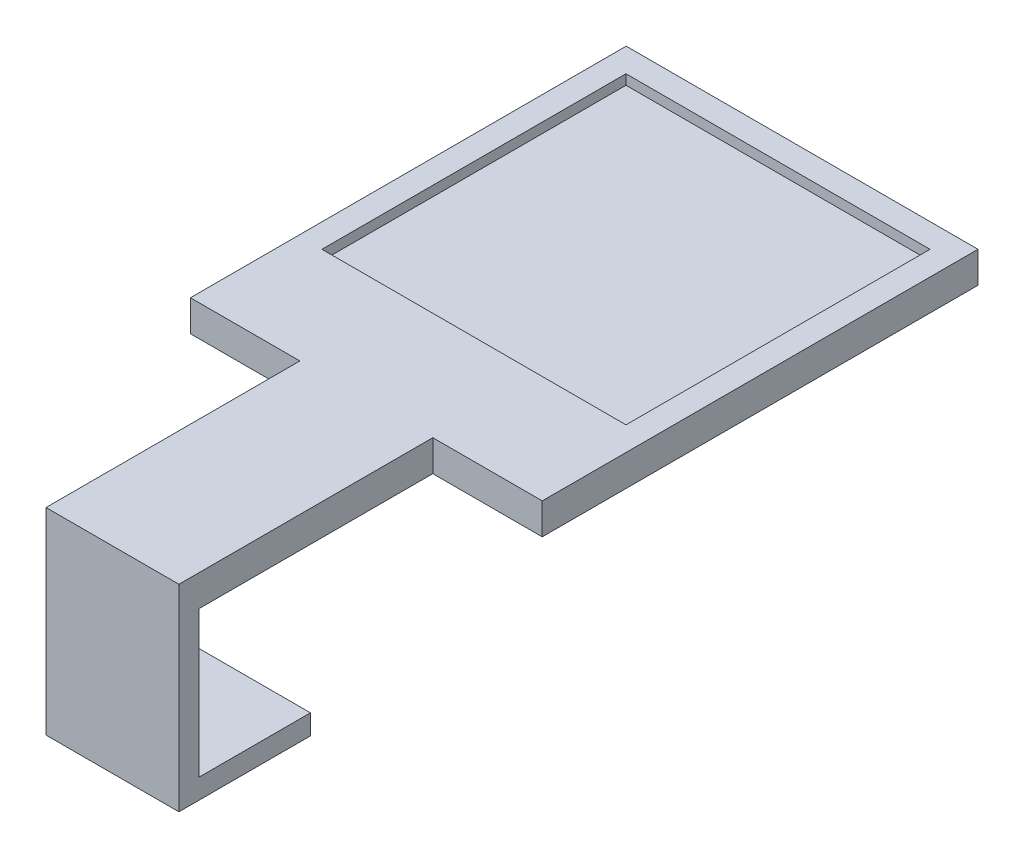
ISO-10303-21;
HEADER;
FILE_DESCRIPTION(('STEP AP214'),'2;1');
FILE_NAME('part.step','',(''),(''),'','','');
FILE_SCHEMA(('AUTOMOTIVE_DESIGN { 1 0 10303 214 1 1 1 1 }'));
ENDSEC;
DATA;
#1=APPLICATION_CONTEXT('core data for automotive mechanical design processes');
#2=APPLICATION_PROTOCOL_DEFINITION('international standard','automotive_design',2000,#1);
#3=PRODUCT_CONTEXT('',#1,'mechanical');
#4=PRODUCT('Part','Part','',(#3));
#5=PRODUCT_RELATED_PRODUCT_CATEGORY('part','',(#4));
#6=PRODUCT_DEFINITION_FORMATION('','',#4);
#7=PRODUCT_DEFINITION_CONTEXT('part definition',#1,'design');
#8=PRODUCT_DEFINITION('design','',#6,#7);
#9=PRODUCT_DEFINITION_SHAPE('','',#8);
#10=(LENGTH_UNIT() NAMED_UNIT(*) SI_UNIT(.MILLI.,.METRE.));
#11=(NAMED_UNIT(*) PLANE_ANGLE_UNIT() SI_UNIT($,.RADIAN.));
#12=(NAMED_UNIT(*) SI_UNIT($,.STERADIAN.) SOLID_ANGLE_UNIT());
#13=UNCERTAINTY_MEASURE_WITH_UNIT(LENGTH_MEASURE(1.E-05),#10,'distance_accuracy_value','');
#14=(GEOMETRIC_REPRESENTATION_CONTEXT(3) GLOBAL_UNCERTAINTY_ASSIGNED_CONTEXT((#13)) GLOBAL_UNIT_ASSIGNED_CONTEXT((#10,
#11,#12)) REPRESENTATION_CONTEXT('',''));
#15=CARTESIAN_POINT('',(0.,0.,0.));
#16=DIRECTION('',(0.,0.,1.));
#17=DIRECTION('',(1.,0.,0.));
#18=AXIS2_PLACEMENT_3D('',#15,#16,#17);
#19=CARTESIAN_POINT('',(-2.35262430939226,-12.88,26.7906077348067));
#20=DIRECTION('',(0.,0.,-1.));
#21=DIRECTION('',(-1.,0.,0.));
#22=AXIS2_PLACEMENT_3D('',#19,#20,#21);
#23=PLANE('',#22);
#24=DIRECTION('',(0.,1.,0.));
#25=VECTOR('',#24,1.);
#26=CARTESIAN_POINT('',(4.29737569060774,-12.88,26.7906077348067));
#27=LINE('',#26,#25);
#28=CARTESIAN_POINT('',(4.29737569060774,-7.3,26.7906077348067));
#29=VERTEX_POINT('',#28);
#30=CARTESIAN_POINT('',(4.29737569060774,0.,26.7906077348067));
#31=VERTEX_POINT('',#30);
#32=EDGE_CURVE('E175',#29,#31,#27,.T.);
#33=ORIENTED_EDGE('',*,*,#32,.F.);
#34=DIRECTION('',(1.,0.,0.));
#35=VECTOR('',#34,1.);
#36=CARTESIAN_POINT('',(4.29737569060774,-7.3,26.7906077348067));
#37=LINE('',#36,#35);
#38=CARTESIAN_POINT('',(-2.35262430939226,-7.3,26.7906077348067));
#39=VERTEX_POINT('',#38);
#40=EDGE_CURVE('E343',#39,#29,#37,.T.);
#41=ORIENTED_EDGE('',*,*,#40,.F.);
#42=DIRECTION('',(0.,1.,0.));
#43=VECTOR('',#42,1.);
#44=CARTESIAN_POINT('',(-2.35262430939226,-12.88,26.7906077348067));
#45=LINE('',#44,#43);
#46=CARTESIAN_POINT('',(-2.35262430939226,0.,26.7906077348067));
#47=VERTEX_POINT('',#46);
#48=EDGE_CURVE('E56',#39,#47,#45,.T.);
#49=ORIENTED_EDGE('',*,*,#48,.T.);
#50=DIRECTION('',(-1.,0.,0.));
#51=VECTOR('',#50,1.);
#52=CARTESIAN_POINT('',(-2.35262430939226,0.,26.7906077348067));
#53=LINE('',#52,#51);
#54=EDGE_CURVE('E160',#31,#47,#53,.T.);
#55=ORIENTED_EDGE('',*,*,#54,.F.);
#56=EDGE_LOOP('',(#33,#41,#49,#55));
#57=FACE_BOUND('',#56,.T.);
#58=ADVANCED_FACE('F34',(#57),#23,.T.);
#59=CARTESIAN_POINT('',(-7.82762430939226,1.56,15.0906077348067));
#60=DIRECTION('',(0.,0.,-1.));
#61=DIRECTION('',(-1.,0.,0.));
#62=AXIS2_PLACEMENT_3D('',#59,#60,#61);
#63=PLANE('',#62);
#64=DIRECTION('',(0.,-1.,0.));
#65=VECTOR('',#64,1.);
#66=CARTESIAN_POINT('',(-2.35262430939226,1.56,15.0906077348067));
#67=LINE('',#66,#65);
#68=CARTESIAN_POINT('',(-2.35262430939226,1.56,15.0906077348067));
#69=VERTEX_POINT('',#68);
#70=CARTESIAN_POINT('',(-2.35262430939226,0.,15.0906077348067));
#71=VERTEX_POINT('',#70);
#72=EDGE_CURVE('E181',#69,#71,#67,.T.);
#73=ORIENTED_EDGE('',*,*,#72,.F.);
#74=DIRECTION('',(1.,0.,0.));
#75=VECTOR('',#74,1.);
#76=CARTESIAN_POINT('',(-7.82762430939226,1.56,15.0906077348067));
#77=LINE('',#76,#75);
#78=CARTESIAN_POINT('',(-7.82762430939226,1.56,15.0906077348067));
#79=VERTEX_POINT('',#78);
#80=EDGE_CURVE('E231',#79,#69,#77,.T.);
#81=ORIENTED_EDGE('',*,*,#80,.F.);
#82=DIRECTION('',(0.,-1.,0.));
#83=VECTOR('',#82,1.);
#84=CARTESIAN_POINT('',(-7.82762430939226,1.56,15.0906077348067));
#85=LINE('',#84,#83);
#86=CARTESIAN_POINT('',(-7.82762430939226,0.,15.0906077348067));
#87=VERTEX_POINT('',#86);
#88=EDGE_CURVE('E11',#79,#87,#85,.T.);
#89=ORIENTED_EDGE('',*,*,#88,.T.);
#90=DIRECTION('',(1.,0.,0.));
#91=VECTOR('',#90,1.);
#92=CARTESIAN_POINT('',(-7.82762430939226,0.,15.0906077348067));
#93=LINE('',#92,#91);
#94=EDGE_CURVE('E242',#87,#71,#93,.T.);
#95=ORIENTED_EDGE('',*,*,#94,.T.);
#96=EDGE_LOOP('',(#73,#81,#89,#95));
#97=FACE_BOUND('',#96,.T.);
#98=ADVANCED_FACE('F288',(#97),#63,.F.);
#99=DIRECTION('',(0.,1.,0.));
#100=VECTOR('',#99,1.);
#101=CARTESIAN_POINT('',(4.29737569060774,1.56,15.0906077348067));
#102=LINE('',#101,#100);
#103=CARTESIAN_POINT('',(4.29737569060774,0.,15.0906077348067));
#104=VERTEX_POINT('',#103);
#105=CARTESIAN_POINT('',(4.29737569060774,1.56,15.0906077348067));
#106=VERTEX_POINT('',#105);
#107=EDGE_CURVE('E184',#104,#106,#102,.T.);
#108=ORIENTED_EDGE('',*,*,#107,.F.);
#109=CARTESIAN_POINT('',(9.77237569060774,0.,15.0906077348067));
#110=VERTEX_POINT('',#109);
#111=EDGE_CURVE('E241',#104,#110,#93,.T.);
#112=ORIENTED_EDGE('',*,*,#111,.T.);
#113=DIRECTION('',(0.,-1.,0.));
#114=VECTOR('',#113,1.);
#115=CARTESIAN_POINT('',(9.77237569060774,1.56,15.0906077348067));
#116=LINE('',#115,#114);
#117=CARTESIAN_POINT('',(9.77237569060774,1.56,15.0906077348067));
#118=VERTEX_POINT('',#117);
#119=EDGE_CURVE('E42',#118,#110,#116,.T.);
#120=ORIENTED_EDGE('',*,*,#119,.F.);
#121=EDGE_CURVE('E229',#106,#118,#77,.T.);
#122=ORIENTED_EDGE('',*,*,#121,.F.);
#123=EDGE_LOOP('',(#108,#112,#120,#122));
#124=FACE_BOUND('',#123,.T.);
#125=ADVANCED_FACE('F279',(#124),#63,.F.);
#126=CARTESIAN_POINT('',(-7.82762430939227,1.56,-6.70939226519334));
#127=DIRECTION('',(1.,0.,0.));
#128=DIRECTION('',(0.,0.,-1.));
#129=AXIS2_PLACEMENT_3D('',#126,#127,#128);
#130=PLANE('',#129);
#131=DIRECTION('',(0.,0.,1.));
#132=VECTOR('',#131,1.);
#133=CARTESIAN_POINT('',(-7.82762430939227,0.,-6.70939226519334));
#134=LINE('',#133,#132);
#135=CARTESIAN_POINT('',(-7.82762430939227,0.,-6.70939226519334));
#136=VERTEX_POINT('',#135);
#137=EDGE_CURVE('E219',#136,#87,#134,.T.);
#138=ORIENTED_EDGE('',*,*,#137,.T.);
#139=ORIENTED_EDGE('',*,*,#88,.F.);
#140=DIRECTION('',(0.,0.,1.));
#141=VECTOR('',#140,1.);
#142=CARTESIAN_POINT('',(-7.82762430939227,1.56,-6.70939226519334));
#143=LINE('',#142,#141);
#144=CARTESIAN_POINT('',(-7.82762430939227,1.56,-6.70939226519334));
#145=VERTEX_POINT('',#144);
#146=EDGE_CURVE('E226',#145,#79,#143,.T.);
#147=ORIENTED_EDGE('',*,*,#146,.F.);
#148=DIRECTION('',(0.,-1.,0.));
#149=VECTOR('',#148,1.);
#150=CARTESIAN_POINT('',(-7.82762430939227,1.56,-6.70939226519334));
#151=LINE('',#150,#149);
#152=EDGE_CURVE('E238',#145,#136,#151,.T.);
#153=ORIENTED_EDGE('',*,*,#152,.T.);
#154=EDGE_LOOP('',(#138,#139,#147,#153));
#155=FACE_BOUND('',#154,.T.);
#156=ADVANCED_FACE('F36',(#155),#130,.F.);
#157=CARTESIAN_POINT('',(9.77237569060773,1.56,-6.70939226519334));
#158=DIRECTION('',(-1.,0.,0.));
#159=DIRECTION('',(0.,0.,1.));
#160=AXIS2_PLACEMENT_3D('',#157,#158,#159);
#161=PLANE('',#160);
#162=DIRECTION('',(0.,0.,-1.));
#163=VECTOR('',#162,1.);
#164=CARTESIAN_POINT('',(9.77237569060773,0.,-6.70939226519334));
#165=LINE('',#164,#163);
#166=CARTESIAN_POINT('',(9.77237569060773,0.,-6.70939226519334));
#167=VERTEX_POINT('',#166);
#168=EDGE_CURVE('E245',#110,#167,#165,.T.);
#169=ORIENTED_EDGE('',*,*,#168,.T.);
#170=DIRECTION('',(0.,-1.,0.));
#171=VECTOR('',#170,1.);
#172=CARTESIAN_POINT('',(9.77237569060773,1.56,-6.70939226519334));
#173=LINE('',#172,#171);
#174=CARTESIAN_POINT('',(9.77237569060773,1.56,-6.70939226519334));
#175=VERTEX_POINT('',#174);
#176=EDGE_CURVE('E250',#175,#167,#173,.T.);
#177=ORIENTED_EDGE('',*,*,#176,.F.);
#178=DIRECTION('',(0.,0.,-1.));
#179=VECTOR('',#178,1.);
#180=CARTESIAN_POINT('',(9.77237569060773,1.56,-6.70939226519334));
#181=LINE('',#180,#179);
#182=EDGE_CURVE('E234',#118,#175,#181,.T.);
#183=ORIENTED_EDGE('',*,*,#182,.F.);
#184=ORIENTED_EDGE('',*,*,#119,.T.);
#185=EDGE_LOOP('',(#169,#177,#183,#184));
#186=FACE_BOUND('',#185,.T.);
#187=ADVANCED_FACE('F257',(#186),#161,.F.);
#188=CARTESIAN_POINT('',(-7.82762430939227,1.56,-6.70939226519334));
#189=DIRECTION('',(0.,0.,1.));
#190=DIRECTION('',(1.,0.,0.));
#191=AXIS2_PLACEMENT_3D('',#188,#189,#190);
#192=PLANE('',#191);
#193=DIRECTION('',(-1.,0.,0.));
#194=VECTOR('',#193,1.);
#195=CARTESIAN_POINT('',(-7.82762430939227,0.,-6.70939226519334));
#196=LINE('',#195,#194);
#197=EDGE_CURVE('E230',#167,#136,#196,.T.);
#198=ORIENTED_EDGE('',*,*,#197,.T.);
#199=ORIENTED_EDGE('',*,*,#152,.F.);
#200=DIRECTION('',(-1.,0.,0.));
#201=VECTOR('',#200,1.);
#202=CARTESIAN_POINT('',(-7.82762430939227,1.56,-6.70939226519334));
#203=LINE('',#202,#201);
#204=EDGE_CURVE('E236',#175,#145,#203,.T.);
#205=ORIENTED_EDGE('',*,*,#204,.F.);
#206=ORIENTED_EDGE('',*,*,#176,.T.);
#207=EDGE_LOOP('',(#198,#199,#205,#206));
#208=FACE_BOUND('',#207,.T.);
#209=ADVANCED_FACE('F269',(#208),#192,.F.);
#210=CARTESIAN_POINT('',(0.,1.56,0.));
#211=DIRECTION('',(0.,1.,0.));
#212=DIRECTION('',(0.,0.,1.));
#213=AXIS2_PLACEMENT_3D('',#210,#211,#212);
#214=PLANE('',#213);
#215=DIRECTION('',(1.,0.,0.));
#216=VECTOR('',#215,1.);
#217=CARTESIAN_POINT('',(-2.35262430939226,1.56,27.7906077348067));
#218=LINE('',#217,#216);
#219=CARTESIAN_POINT('',(-2.35262430939226,1.56,27.7906077348067));
#220=VERTEX_POINT('',#219);
#221=CARTESIAN_POINT('',(4.29737569060774,1.56,27.7906077348067));
#222=VERTEX_POINT('',#221);
#223=EDGE_CURVE('E169',#220,#222,#218,.T.);
#224=ORIENTED_EDGE('',*,*,#223,.T.);
#225=DIRECTION('',(0.,0.,-1.));
#226=VECTOR('',#225,1.);
#227=CARTESIAN_POINT('',(4.29737569060774,1.56,40.6706077348067));
#228=LINE('',#227,#226);
#229=EDGE_CURVE('E174',#222,#106,#228,.T.);
#230=ORIENTED_EDGE('',*,*,#229,.T.);
#231=ORIENTED_EDGE('',*,*,#121,.T.);
#232=ORIENTED_EDGE('',*,*,#182,.T.);
#233=ORIENTED_EDGE('',*,*,#204,.T.);
#234=ORIENTED_EDGE('',*,*,#146,.T.);
#235=ORIENTED_EDGE('',*,*,#80,.T.);
#236=DIRECTION('',(0.,0.,-1.));
#237=VECTOR('',#236,1.);
#238=CARTESIAN_POINT('',(-2.35262430939226,1.56,40.6706077348067));
#239=LINE('',#238,#237);
#240=EDGE_CURVE('E186',#220,#69,#239,.T.);
#241=ORIENTED_EDGE('',*,*,#240,.F.);
#242=EDGE_LOOP('',(#224,#230,#231,#232,#233,#234,#235,#241));
#243=FACE_BOUND('',#242,.T.);
#244=DIRECTION('',(0.,0.,1.));
#245=VECTOR('',#244,1.);
#246=CARTESIAN_POINT('',(-6.63762430939226,1.56,-5.50939226519334));
#247=LINE('',#246,#245);
#248=CARTESIAN_POINT('',(-6.63762430939226,1.56,-5.50939226519334));
#249=VERTEX_POINT('',#248);
#250=CARTESIAN_POINT('',(-6.63762430939226,1.56,9.70060773480666));
#251=VERTEX_POINT('',#250);
#252=EDGE_CURVE('E193',#249,#251,#247,.T.);
#253=ORIENTED_EDGE('',*,*,#252,.F.);
#254=DIRECTION('',(-1.,0.,0.));
#255=VECTOR('',#254,1.);
#256=CARTESIAN_POINT('',(-6.63762430939226,1.56,-5.50939226519334));
#257=LINE('',#256,#255);
#258=CARTESIAN_POINT('',(8.57237569060774,1.56,-5.50939226519334));
#259=VERTEX_POINT('',#258);
#260=EDGE_CURVE('E198',#259,#249,#257,.T.);
#261=ORIENTED_EDGE('',*,*,#260,.F.);
#262=DIRECTION('',(0.,0.,-1.));
#263=VECTOR('',#262,1.);
#264=CARTESIAN_POINT('',(8.57237569060774,1.56,-5.50939226519334));
#265=LINE('',#264,#263);
#266=CARTESIAN_POINT('',(8.57237569060774,1.56,9.70060773480666));
#267=VERTEX_POINT('',#266);
#268=EDGE_CURVE('E212',#267,#259,#265,.T.);
#269=ORIENTED_EDGE('',*,*,#268,.F.);
#270=DIRECTION('',(1.,0.,0.));
#271=VECTOR('',#270,1.);
#272=CARTESIAN_POINT('',(-6.63762430939226,1.56,9.70060773480666));
#273=LINE('',#272,#271);
#274=EDGE_CURVE('E209',#251,#267,#273,.T.);
#275=ORIENTED_EDGE('',*,*,#274,.F.);
#276=EDGE_LOOP('',(#253,#261,#269,#275));
#277=FACE_BOUND('',#276,.T.);
#278=ADVANCED_FACE('F275',(#243,#277),#214,.T.);
#279=CARTESIAN_POINT('',(0.,0.,0.));
#280=DIRECTION('',(0.,1.,0.));
#281=DIRECTION('',(0.,0.,1.));
#282=AXIS2_PLACEMENT_3D('',#279,#280,#281);
#283=PLANE('',#282);
#284=DIRECTION('',(0.,0.,-1.));
#285=VECTOR('',#284,1.);
#286=CARTESIAN_POINT('',(4.29737569060774,0.,40.6706077348067));
#287=LINE('',#286,#285);
#288=EDGE_CURVE('E189',#31,#104,#287,.T.);
#289=ORIENTED_EDGE('',*,*,#288,.F.);
#290=ORIENTED_EDGE('',*,*,#54,.T.);
#291=DIRECTION('',(0.,0.,-1.));
#292=VECTOR('',#291,1.);
#293=CARTESIAN_POINT('',(-2.35262430939226,0.,40.6706077348067));
#294=LINE('',#293,#292);
#295=EDGE_CURVE('E191',#47,#71,#294,.T.);
#296=ORIENTED_EDGE('',*,*,#295,.T.);
#297=ORIENTED_EDGE('',*,*,#94,.F.);
#298=ORIENTED_EDGE('',*,*,#137,.F.);
#299=ORIENTED_EDGE('',*,*,#197,.F.);
#300=ORIENTED_EDGE('',*,*,#168,.F.);
#301=ORIENTED_EDGE('',*,*,#111,.F.);
#302=EDGE_LOOP('',(#289,#290,#296,#297,#298,#299,#300,#301));
#303=FACE_BOUND('',#302,.T.);
#304=ADVANCED_FACE('F265',(#303),#283,.F.);
#305=CARTESIAN_POINT('',(-6.63762430939226,1.06,-5.50939226519334));
#306=DIRECTION('',(-1.,0.,0.));
#307=DIRECTION('',(0.,0.,1.));
#308=AXIS2_PLACEMENT_3D('',#305,#306,#307);
#309=PLANE('',#308);
#310=ORIENTED_EDGE('',*,*,#252,.T.);
#311=DIRECTION('',(0.,1.,0.));
#312=VECTOR('',#311,1.);
#313=CARTESIAN_POINT('',(-6.63762430939226,1.06,9.70060773480666));
#314=LINE('',#313,#312);
#315=CARTESIAN_POINT('',(-6.63762430939226,1.06,9.70060773480666));
#316=VERTEX_POINT('',#315);
#317=EDGE_CURVE('E207',#316,#251,#314,.T.);
#318=ORIENTED_EDGE('',*,*,#317,.F.);
#319=DIRECTION('',(0.,0.,1.));
#320=VECTOR('',#319,1.);
#321=CARTESIAN_POINT('',(-6.63762430939226,1.06,-5.50939226519334));
#322=LINE('',#321,#320);
#323=CARTESIAN_POINT('',(-6.63762430939226,1.06,-5.50939226519334));
#324=VERTEX_POINT('',#323);
#325=EDGE_CURVE('E194',#324,#316,#322,.T.);
#326=ORIENTED_EDGE('',*,*,#325,.F.);
#327=DIRECTION('',(0.,1.,0.));
#328=VECTOR('',#327,1.);
#329=CARTESIAN_POINT('',(-6.63762430939226,1.06,-5.50939226519334));
#330=LINE('',#329,#328);
#331=EDGE_CURVE('E217',#324,#249,#330,.T.);
#332=ORIENTED_EDGE('',*,*,#331,.T.);
#333=EDGE_LOOP('',(#310,#318,#326,#332));
#334=FACE_BOUND('',#333,.T.);
#335=ADVANCED_FACE('F302',(#334),#309,.F.);
#336=CARTESIAN_POINT('',(-6.63762430939226,1.06,-5.50939226519334));
#337=DIRECTION('',(0.,0.,-1.));
#338=DIRECTION('',(-1.,0.,0.));
#339=AXIS2_PLACEMENT_3D('',#336,#337,#338);
#340=PLANE('',#339);
#341=ORIENTED_EDGE('',*,*,#260,.T.);
#342=ORIENTED_EDGE('',*,*,#331,.F.);
#343=DIRECTION('',(-1.,0.,0.));
#344=VECTOR('',#343,1.);
#345=CARTESIAN_POINT('',(-6.63762430939226,1.06,-5.50939226519334));
#346=LINE('',#345,#344);
#347=CARTESIAN_POINT('',(8.57237569060774,1.06,-5.50939226519334));
#348=VERTEX_POINT('',#347);
#349=EDGE_CURVE('E204',#348,#324,#346,.T.);
#350=ORIENTED_EDGE('',*,*,#349,.F.);
#351=DIRECTION('',(0.,1.,0.));
#352=VECTOR('',#351,1.);
#353=CARTESIAN_POINT('',(8.57237569060774,1.06,-5.50939226519334));
#354=LINE('',#353,#352);
#355=EDGE_CURVE('E220',#348,#259,#354,.T.);
#356=ORIENTED_EDGE('',*,*,#355,.T.);
#357=EDGE_LOOP('',(#341,#342,#350,#356));
#358=FACE_BOUND('',#357,.T.);
#359=ADVANCED_FACE('F307',(#358),#340,.F.);
#360=CARTESIAN_POINT('',(8.57237569060774,1.06,-5.50939226519334));
#361=DIRECTION('',(1.,0.,0.));
#362=DIRECTION('',(0.,0.,-1.));
#363=AXIS2_PLACEMENT_3D('',#360,#361,#362);
#364=PLANE('',#363);
#365=ORIENTED_EDGE('',*,*,#268,.T.);
#366=ORIENTED_EDGE('',*,*,#355,.F.);
#367=DIRECTION('',(0.,0.,-1.));
#368=VECTOR('',#367,1.);
#369=CARTESIAN_POINT('',(8.57237569060774,1.06,-5.50939226519334));
#370=LINE('',#369,#368);
#371=CARTESIAN_POINT('',(8.57237569060774,1.06,9.70060773480666));
#372=VERTEX_POINT('',#371);
#373=EDGE_CURVE('E201',#372,#348,#370,.T.);
#374=ORIENTED_EDGE('',*,*,#373,.F.);
#375=DIRECTION('',(0.,1.,0.));
#376=VECTOR('',#375,1.);
#377=CARTESIAN_POINT('',(8.57237569060774,1.06,9.70060773480666));
#378=LINE('',#377,#376);
#379=EDGE_CURVE('E222',#372,#267,#378,.T.);
#380=ORIENTED_EDGE('',*,*,#379,.T.);
#381=EDGE_LOOP('',(#365,#366,#374,#380));
#382=FACE_BOUND('',#381,.T.);
#383=ADVANCED_FACE('F313',(#382),#364,.F.);
#384=CARTESIAN_POINT('',(-6.63762430939226,1.06,9.70060773480666));
#385=DIRECTION('',(0.,0.,1.));
#386=DIRECTION('',(1.,0.,0.));
#387=AXIS2_PLACEMENT_3D('',#384,#385,#386);
#388=PLANE('',#387);
#389=ORIENTED_EDGE('',*,*,#274,.T.);
#390=ORIENTED_EDGE('',*,*,#379,.F.);
#391=DIRECTION('',(1.,0.,0.));
#392=VECTOR('',#391,1.);
#393=CARTESIAN_POINT('',(-6.63762430939226,1.06,9.70060773480666));
#394=LINE('',#393,#392);
#395=EDGE_CURVE('E197',#316,#372,#394,.T.);
#396=ORIENTED_EDGE('',*,*,#395,.F.);
#397=ORIENTED_EDGE('',*,*,#317,.T.);
#398=EDGE_LOOP('',(#389,#390,#396,#397));
#399=FACE_BOUND('',#398,.T.);
#400=ADVANCED_FACE('F309',(#399),#388,.F.);
#401=CARTESIAN_POINT('',(0.,1.06,0.));
#402=DIRECTION('',(0.,1.,0.));
#403=DIRECTION('',(0.,0.,1.));
#404=AXIS2_PLACEMENT_3D('',#401,#402,#403);
#405=PLANE('',#404);
#406=ORIENTED_EDGE('',*,*,#325,.T.);
#407=ORIENTED_EDGE('',*,*,#395,.T.);
#408=ORIENTED_EDGE('',*,*,#373,.T.);
#409=ORIENTED_EDGE('',*,*,#349,.T.);
#410=EDGE_LOOP('',(#406,#407,#408,#409));
#411=FACE_BOUND('',#410,.T.);
#412=ADVANCED_FACE('F312',(#411),#405,.T.);
#413=CARTESIAN_POINT('',(-2.35262430939226,1.56,40.6706077348067));
#414=DIRECTION('',(1.,0.,0.));
#415=DIRECTION('',(0.,0.,-1.));
#416=AXIS2_PLACEMENT_3D('',#413,#414,#415);
#417=PLANE('',#416);
#418=DIRECTION('',(0.,0.,1.));
#419=VECTOR('',#418,1.);
#420=CARTESIAN_POINT('',(-2.35262430939226,-8.3,21.2106077348067));
#421=LINE('',#420,#419);
#422=CARTESIAN_POINT('',(-2.35262430939226,-8.3,21.2106077348067));
#423=VERTEX_POINT('',#422);
#424=CARTESIAN_POINT('',(-2.35262430939226,-8.3,27.7906077348067));
#425=VERTEX_POINT('',#424);
#426=EDGE_CURVE('E161',#423,#425,#421,.T.);
#427=ORIENTED_EDGE('',*,*,#426,.T.);
#428=DIRECTION('',(0.,1.,0.));
#429=VECTOR('',#428,1.);
#430=CARTESIAN_POINT('',(-2.35262430939226,-12.88,27.7906077348067));
#431=LINE('',#430,#429);
#432=EDGE_CURVE('E168',#425,#220,#431,.T.);
#433=ORIENTED_EDGE('',*,*,#432,.T.);
#434=ORIENTED_EDGE('',*,*,#240,.T.);
#435=ORIENTED_EDGE('',*,*,#72,.T.);
#436=ORIENTED_EDGE('',*,*,#295,.F.);
#437=ORIENTED_EDGE('',*,*,#48,.F.);
#438=DIRECTION('',(0.,0.,1.));
#439=VECTOR('',#438,1.);
#440=CARTESIAN_POINT('',(-2.35262430939226,-7.3,21.2106077348067));
#441=LINE('',#440,#439);
#442=CARTESIAN_POINT('',(-2.35262430939226,-7.3,21.2106077348067));
#443=VERTEX_POINT('',#442);
#444=EDGE_CURVE('E49',#443,#39,#441,.T.);
#445=ORIENTED_EDGE('',*,*,#444,.F.);
#446=DIRECTION('',(0.,1.,0.));
#447=VECTOR('',#446,1.);
#448=CARTESIAN_POINT('',(-2.35262430939226,-7.3,21.2106077348067));
#449=LINE('',#448,#447);
#450=EDGE_CURVE('E345',#423,#443,#449,.T.);
#451=ORIENTED_EDGE('',*,*,#450,.F.);
#452=EDGE_LOOP('',(#427,#433,#434,#435,#436,#437,#445,#451));
#453=FACE_BOUND('',#452,.T.);
#454=ADVANCED_FACE('F285',(#453),#417,.F.);
#455=CARTESIAN_POINT('',(4.29737569060774,1.56,40.6706077348067));
#456=DIRECTION('',(-1.,0.,0.));
#457=DIRECTION('',(0.,0.,1.));
#458=AXIS2_PLACEMENT_3D('',#455,#456,#457);
#459=PLANE('',#458);
#460=DIRECTION('',(0.,1.,0.));
#461=VECTOR('',#460,1.);
#462=CARTESIAN_POINT('',(4.29737569060774,-12.88,27.7906077348067));
#463=LINE('',#462,#461);
#464=CARTESIAN_POINT('',(4.29737569060774,-8.3,27.7906077348067));
#465=VERTEX_POINT('',#464);
#466=EDGE_CURVE('E166',#465,#222,#463,.T.);
#467=ORIENTED_EDGE('',*,*,#466,.F.);
#468=DIRECTION('',(0.,0.,1.));
#469=VECTOR('',#468,1.);
#470=CARTESIAN_POINT('',(4.29737569060774,-8.3,21.2106077348067));
#471=LINE('',#470,#469);
#472=CARTESIAN_POINT('',(4.29737569060774,-8.3,21.2106077348067));
#473=VERTEX_POINT('',#472);
#474=EDGE_CURVE('E149',#473,#465,#471,.T.);
#475=ORIENTED_EDGE('',*,*,#474,.F.);
#476=DIRECTION('',(0.,-1.,0.));
#477=VECTOR('',#476,1.);
#478=CARTESIAN_POINT('',(4.29737569060774,-7.3,21.2106077348067));
#479=LINE('',#478,#477);
#480=CARTESIAN_POINT('',(4.29737569060774,-7.3,21.2106077348067));
#481=VERTEX_POINT('',#480);
#482=EDGE_CURVE('E340',#481,#473,#479,.T.);
#483=ORIENTED_EDGE('',*,*,#482,.F.);
#484=DIRECTION('',(0.,0.,1.));
#485=VECTOR('',#484,1.);
#486=CARTESIAN_POINT('',(4.29737569060774,-7.3,21.2106077348067));
#487=LINE('',#486,#485);
#488=EDGE_CURVE('E351',#481,#29,#487,.T.);
#489=ORIENTED_EDGE('',*,*,#488,.T.);
#490=ORIENTED_EDGE('',*,*,#32,.T.);
#491=ORIENTED_EDGE('',*,*,#288,.T.);
#492=ORIENTED_EDGE('',*,*,#107,.T.);
#493=ORIENTED_EDGE('',*,*,#229,.F.);
#494=EDGE_LOOP('',(#467,#475,#483,#489,#490,#491,#492,#493));
#495=FACE_BOUND('',#494,.T.);
#496=ADVANCED_FACE('F172',(#495),#459,.F.);
#497=CARTESIAN_POINT('',(-2.35262430939226,-12.88,27.7906077348067));
#498=DIRECTION('',(0.,0.,1.));
#499=DIRECTION('',(1.,0.,0.));
#500=AXIS2_PLACEMENT_3D('',#497,#498,#499);
#501=PLANE('',#500);
#502=DIRECTION('',(1.,0.,0.));
#503=VECTOR('',#502,1.);
#504=CARTESIAN_POINT('',(4.29737569060774,-8.3,27.7906077348067));
#505=LINE('',#504,#503);
#506=EDGE_CURVE('E153',#425,#465,#505,.T.);
#507=ORIENTED_EDGE('',*,*,#506,.T.);
#508=ORIENTED_EDGE('',*,*,#466,.T.);
#509=ORIENTED_EDGE('',*,*,#223,.F.);
#510=ORIENTED_EDGE('',*,*,#432,.F.);
#511=EDGE_LOOP('',(#507,#508,#509,#510));
#512=FACE_BOUND('',#511,.T.);
#513=ADVANCED_FACE('F164',(#512),#501,.T.);
#514=CARTESIAN_POINT('',(4.29737569060774,-8.3,21.2106077348067));
#515=DIRECTION('',(0.,1.,0.));
#516=DIRECTION('',(0.,0.,1.));
#517=AXIS2_PLACEMENT_3D('',#514,#515,#516);
#518=PLANE('',#517);
#519=ORIENTED_EDGE('',*,*,#474,.T.);
#520=ORIENTED_EDGE('',*,*,#506,.F.);
#521=ORIENTED_EDGE('',*,*,#426,.F.);
#522=DIRECTION('',(-1.,0.,0.));
#523=VECTOR('',#522,1.);
#524=CARTESIAN_POINT('',(4.29737569060774,-8.3,21.2106077348067));
#525=LINE('',#524,#523);
#526=EDGE_CURVE('E155',#473,#423,#525,.T.);
#527=ORIENTED_EDGE('',*,*,#526,.F.);
#528=EDGE_LOOP('',(#519,#520,#521,#527));
#529=FACE_BOUND('',#528,.T.);
#530=ADVANCED_FACE('F151',(#529),#518,.F.);
#531=CARTESIAN_POINT('',(4.29737569060774,-7.3,21.2106077348067));
#532=DIRECTION('',(0.,-1.,0.));
#533=DIRECTION('',(0.,0.,-1.));
#534=AXIS2_PLACEMENT_3D('',#531,#532,#533);
#535=PLANE('',#534);
#536=ORIENTED_EDGE('',*,*,#40,.T.);
#537=ORIENTED_EDGE('',*,*,#488,.F.);
#538=DIRECTION('',(1.,0.,0.));
#539=VECTOR('',#538,1.);
#540=CARTESIAN_POINT('',(4.29737569060774,-7.3,21.2106077348067));
#541=LINE('',#540,#539);
#542=EDGE_CURVE('E341',#443,#481,#541,.T.);
#543=ORIENTED_EDGE('',*,*,#542,.F.);
#544=ORIENTED_EDGE('',*,*,#444,.T.);
#545=EDGE_LOOP('',(#536,#537,#543,#544));
#546=FACE_BOUND('',#545,.T.);
#547=ADVANCED_FACE('F332',(#546),#535,.F.);
#548=CARTESIAN_POINT('',(0.,0.,21.2106077348067));
#549=DIRECTION('',(0.,0.,-1.));
#550=DIRECTION('',(-1.,0.,0.));
#551=AXIS2_PLACEMENT_3D('',#548,#549,#550);
#552=PLANE('',#551);
#553=ORIENTED_EDGE('',*,*,#482,.T.);
#554=ORIENTED_EDGE('',*,*,#526,.T.);
#555=ORIENTED_EDGE('',*,*,#450,.T.);
#556=ORIENTED_EDGE('',*,*,#542,.T.);
#557=EDGE_LOOP('',(#553,#554,#555,#556));
#558=FACE_BOUND('',#557,.T.);
#559=ADVANCED_FACE('F335',(#558),#552,.T.);
#560=CLOSED_SHELL('',(#58,#98,#125,#156,#187,#209,#278,#304,#335,#359,#383,#400,#412,#454,#496,
#513,#530,#547,#559));
#561=MANIFOLD_SOLID_BREP('B2',#560);
#562=ADVANCED_BREP_SHAPE_REPRESENTATION('',(#18,#561),#14);
#563=SHAPE_DEFINITION_REPRESENTATION(#9,#562);
ENDSEC;
END-ISO-10303-21;
